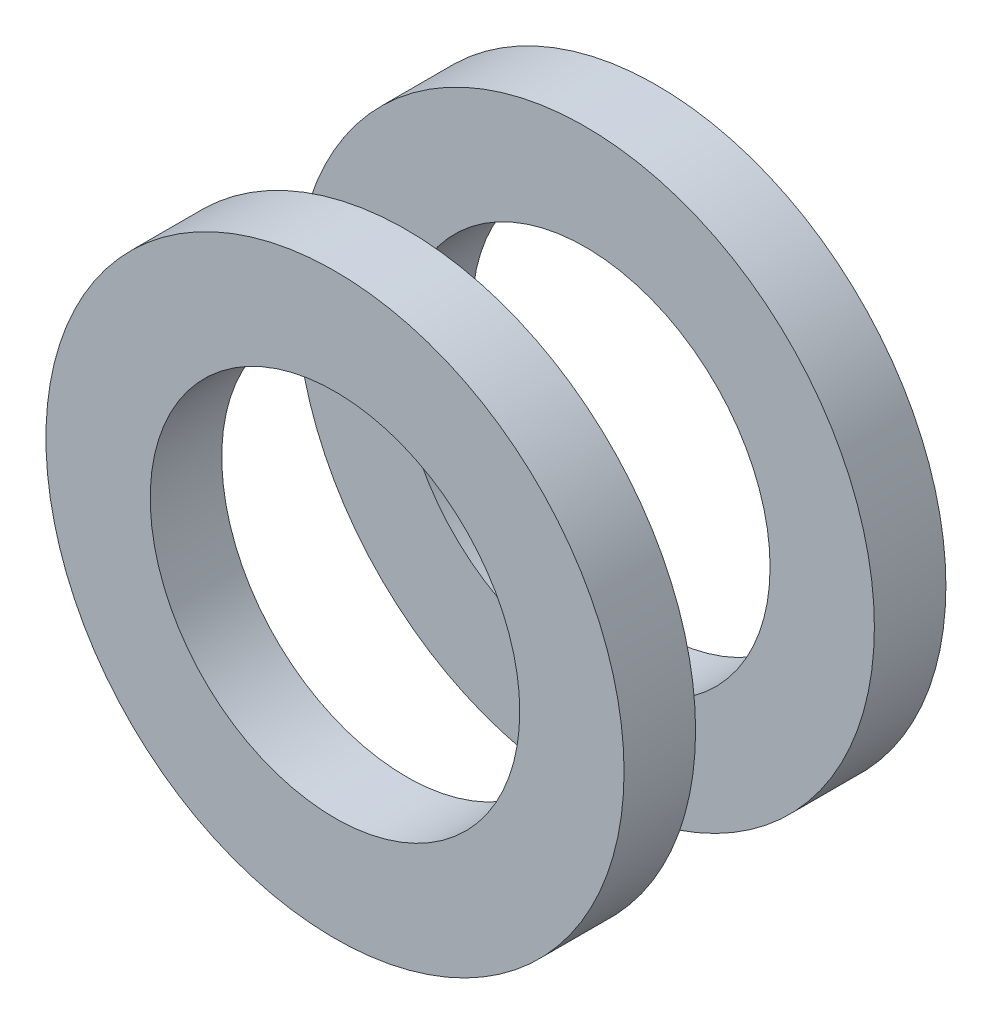
ISO-10303-21;
HEADER;
FILE_DESCRIPTION(('STEP AP214'),'2;1');
FILE_NAME('part.step','',(''),(''),'','','');
FILE_SCHEMA(('AUTOMOTIVE_DESIGN { 1 0 10303 214 1 1 1 1 }'));
ENDSEC;
DATA;
#1=APPLICATION_CONTEXT('core data for automotive mechanical design processes');
#2=APPLICATION_PROTOCOL_DEFINITION('international standard','automotive_design',2000,#1);
#3=PRODUCT_CONTEXT('',#1,'mechanical');
#4=PRODUCT('Part','Part','',(#3));
#5=PRODUCT_RELATED_PRODUCT_CATEGORY('part','',(#4));
#6=PRODUCT_DEFINITION_FORMATION('','',#4);
#7=PRODUCT_DEFINITION_CONTEXT('part definition',#1,'design');
#8=PRODUCT_DEFINITION('design','',#6,#7);
#9=PRODUCT_DEFINITION_SHAPE('','',#8);
#10=(LENGTH_UNIT() NAMED_UNIT(*) SI_UNIT(.MILLI.,.METRE.));
#11=(NAMED_UNIT(*) PLANE_ANGLE_UNIT() SI_UNIT($,.RADIAN.));
#12=(NAMED_UNIT(*) SI_UNIT($,.STERADIAN.) SOLID_ANGLE_UNIT());
#13=UNCERTAINTY_MEASURE_WITH_UNIT(LENGTH_MEASURE(1.E-05),#10,'distance_accuracy_value','');
#14=(GEOMETRIC_REPRESENTATION_CONTEXT(3) GLOBAL_UNCERTAINTY_ASSIGNED_CONTEXT((#13)) GLOBAL_UNIT_ASSIGNED_CONTEXT((#10,
#11,#12)) REPRESENTATION_CONTEXT('',''));
#15=CARTESIAN_POINT('',(0.,0.,0.));
#16=DIRECTION('',(0.,0.,1.));
#17=DIRECTION('',(1.,0.,0.));
#18=AXIS2_PLACEMENT_3D('',#15,#16,#17);
#19=CARTESIAN_POINT('',(0.,0.,27.));
#20=DIRECTION('',(0.,0.,1.));
#21=DIRECTION('',(1.,0.,0.));
#22=AXIS2_PLACEMENT_3D('',#19,#20,#21);
#23=PLANE('',#22);
#24=CARTESIAN_POINT('',(0.,0.,27.));
#25=DIRECTION('',(0.,0.,1.));
#26=DIRECTION('',(1.,0.,0.));
#27=AXIS2_PLACEMENT_3D('',#24,#25,#26);
#28=CIRCLE('',#27,48.5);
#29=CARTESIAN_POINT('',(48.5,0.,27.));
#30=VERTEX_POINT('',#29);
#31=EDGE_CURVE('E11',#30,#30,#28,.T.);
#32=ORIENTED_EDGE('',*,*,#31,.T.);
#33=EDGE_LOOP('',(#32));
#34=FACE_BOUND('',#33,.T.);
#35=CARTESIAN_POINT('',(0.,0.,27.));
#36=DIRECTION('',(0.,0.,1.));
#37=DIRECTION('',(1.,0.,0.));
#38=AXIS2_PLACEMENT_3D('',#35,#36,#37);
#39=CIRCLE('',#38,31.);
#40=CARTESIAN_POINT('',(31.,0.,27.));
#41=VERTEX_POINT('',#40);
#42=EDGE_CURVE('E57',#41,#41,#39,.T.);
#43=ORIENTED_EDGE('',*,*,#42,.F.);
#44=EDGE_LOOP('',(#43));
#45=FACE_BOUND('',#44,.T.);
#46=ADVANCED_FACE('F44',(#34,#45),#23,.T.);
#47=CARTESIAN_POINT('',(0.,0.,15.));
#48=DIRECTION('',(0.,0.,1.));
#49=DIRECTION('',(1.,0.,0.));
#50=AXIS2_PLACEMENT_3D('',#47,#48,#49);
#51=PLANE('',#50);
#52=CARTESIAN_POINT('',(0.,0.,15.));
#53=DIRECTION('',(0.,0.,1.));
#54=DIRECTION('',(1.,0.,0.));
#55=AXIS2_PLACEMENT_3D('',#52,#53,#54);
#56=CIRCLE('',#55,48.5);
#57=CARTESIAN_POINT('',(48.5,0.,15.));
#58=VERTEX_POINT('',#57);
#59=EDGE_CURVE('E48',#58,#58,#56,.T.);
#60=ORIENTED_EDGE('',*,*,#59,.F.);
#61=EDGE_LOOP('',(#60));
#62=FACE_BOUND('',#61,.T.);
#63=CARTESIAN_POINT('',(0.,0.,15.));
#64=DIRECTION('',(0.,0.,1.));
#65=DIRECTION('',(1.,0.,0.));
#66=AXIS2_PLACEMENT_3D('',#63,#64,#65);
#67=CIRCLE('',#66,31.);
#68=CARTESIAN_POINT('',(31.,0.,15.));
#69=VERTEX_POINT('',#68);
#70=EDGE_CURVE('E59',#69,#69,#67,.T.);
#71=ORIENTED_EDGE('',*,*,#70,.T.);
#72=EDGE_LOOP('',(#71));
#73=FACE_BOUND('',#72,.T.);
#74=ADVANCED_FACE('F71',(#62,#73),#51,.F.);
#75=CARTESIAN_POINT('',(0.,0.,27.));
#76=DIRECTION('',(0.,0.,-1.));
#77=DIRECTION('',(-1.,0.,0.));
#78=AXIS2_PLACEMENT_3D('',#75,#76,#77);
#79=CYLINDRICAL_SURFACE('',#78,48.5);
#80=ORIENTED_EDGE('',*,*,#31,.F.);
#81=EDGE_LOOP('',(#80));
#82=FACE_BOUND('',#81,.T.);
#83=ORIENTED_EDGE('',*,*,#59,.T.);
#84=EDGE_LOOP('',(#83));
#85=FACE_BOUND('',#84,.T.);
#86=ADVANCED_FACE('F46',(#82,#85),#79,.T.);
#87=CARTESIAN_POINT('',(0.,0.,27.));
#88=DIRECTION('',(0.,0.,-1.));
#89=DIRECTION('',(-1.,0.,0.));
#90=AXIS2_PLACEMENT_3D('',#87,#88,#89);
#91=CYLINDRICAL_SURFACE('',#90,31.);
#92=ORIENTED_EDGE('',*,*,#42,.T.);
#93=EDGE_LOOP('',(#92));
#94=FACE_BOUND('',#93,.T.);
#95=ORIENTED_EDGE('',*,*,#70,.F.);
#96=EDGE_LOOP('',(#95));
#97=FACE_BOUND('',#96,.T.);
#98=ADVANCED_FACE('F67',(#94,#97),#91,.F.);
#99=CLOSED_SHELL('',(#46,#74,#86,#98));
#100=MANIFOLD_SOLID_BREP('B2',#99);
#101=CARTESIAN_POINT('',(0.,0.,-15.));
#102=DIRECTION('',(0.,0.,1.));
#103=DIRECTION('',(1.,0.,0.));
#104=AXIS2_PLACEMENT_3D('',#101,#102,#103);
#105=PLANE('',#104);
#106=CARTESIAN_POINT('',(0.,0.,-15.));
#107=DIRECTION('',(0.,0.,1.));
#108=DIRECTION('',(1.,0.,0.));
#109=AXIS2_PLACEMENT_3D('',#106,#107,#108);
#110=CIRCLE('',#109,48.5);
#111=CARTESIAN_POINT('',(48.5,0.,-15.));
#112=VERTEX_POINT('',#111);
#113=EDGE_CURVE('E43',#112,#112,#110,.T.);
#114=ORIENTED_EDGE('',*,*,#113,.T.);
#115=EDGE_LOOP('',(#114));
#116=FACE_BOUND('',#115,.T.);
#117=CARTESIAN_POINT('',(0.,0.,-15.));
#118=DIRECTION('',(0.,0.,1.));
#119=DIRECTION('',(1.,0.,0.));
#120=AXIS2_PLACEMENT_3D('',#117,#118,#119);
#121=CIRCLE('',#120,31.);
#122=CARTESIAN_POINT('',(31.,0.,-15.));
#123=VERTEX_POINT('',#122);
#124=EDGE_CURVE('E127',#123,#123,#121,.T.);
#125=ORIENTED_EDGE('',*,*,#124,.F.);
#126=EDGE_LOOP('',(#125));
#127=FACE_BOUND('',#126,.T.);
#128=ADVANCED_FACE('F113',(#116,#127),#105,.T.);
#129=CARTESIAN_POINT('',(0.,0.,-27.));
#130=DIRECTION('',(0.,0.,1.));
#131=DIRECTION('',(1.,0.,0.));
#132=AXIS2_PLACEMENT_3D('',#129,#130,#131);
#133=PLANE('',#132);
#134=CARTESIAN_POINT('',(0.,0.,-27.));
#135=DIRECTION('',(0.,0.,1.));
#136=DIRECTION('',(1.,0.,0.));
#137=AXIS2_PLACEMENT_3D('',#134,#135,#136);
#138=CIRCLE('',#137,48.5);
#139=CARTESIAN_POINT('',(48.5,0.,-27.));
#140=VERTEX_POINT('',#139);
#141=EDGE_CURVE('E117',#140,#140,#138,.T.);
#142=ORIENTED_EDGE('',*,*,#141,.F.);
#143=EDGE_LOOP('',(#142));
#144=FACE_BOUND('',#143,.T.);
#145=CARTESIAN_POINT('',(0.,0.,-27.));
#146=DIRECTION('',(0.,0.,1.));
#147=DIRECTION('',(1.,0.,0.));
#148=AXIS2_PLACEMENT_3D('',#145,#146,#147);
#149=CIRCLE('',#148,31.);
#150=CARTESIAN_POINT('',(31.,0.,-27.));
#151=VERTEX_POINT('',#150);
#152=EDGE_CURVE('E129',#151,#151,#149,.T.);
#153=ORIENTED_EDGE('',*,*,#152,.T.);
#154=EDGE_LOOP('',(#153));
#155=FACE_BOUND('',#154,.T.);
#156=ADVANCED_FACE('F140',(#144,#155),#133,.F.);
#157=CARTESIAN_POINT('',(0.,0.,-15.));
#158=DIRECTION('',(0.,0.,-1.));
#159=DIRECTION('',(-1.,0.,0.));
#160=AXIS2_PLACEMENT_3D('',#157,#158,#159);
#161=CYLINDRICAL_SURFACE('',#160,48.5);
#162=ORIENTED_EDGE('',*,*,#113,.F.);
#163=EDGE_LOOP('',(#162));
#164=FACE_BOUND('',#163,.T.);
#165=ORIENTED_EDGE('',*,*,#141,.T.);
#166=EDGE_LOOP('',(#165));
#167=FACE_BOUND('',#166,.T.);
#168=ADVANCED_FACE('F115',(#164,#167),#161,.T.);
#169=CARTESIAN_POINT('',(0.,0.,-15.));
#170=DIRECTION('',(0.,0.,-1.));
#171=DIRECTION('',(-1.,0.,0.));
#172=AXIS2_PLACEMENT_3D('',#169,#170,#171);
#173=CYLINDRICAL_SURFACE('',#172,31.);
#174=ORIENTED_EDGE('',*,*,#124,.T.);
#175=EDGE_LOOP('',(#174));
#176=FACE_BOUND('',#175,.T.);
#177=ORIENTED_EDGE('',*,*,#152,.F.);
#178=EDGE_LOOP('',(#177));
#179=FACE_BOUND('',#178,.T.);
#180=ADVANCED_FACE('F136',(#176,#179),#173,.F.);
#181=CLOSED_SHELL('',(#128,#156,#168,#180));
#182=MANIFOLD_SOLID_BREP('B6',#181);
#183=ADVANCED_BREP_SHAPE_REPRESENTATION('',(#18,#100,#182),#14);
#184=SHAPE_DEFINITION_REPRESENTATION(#9,#183);
ENDSEC;
END-ISO-10303-21;
